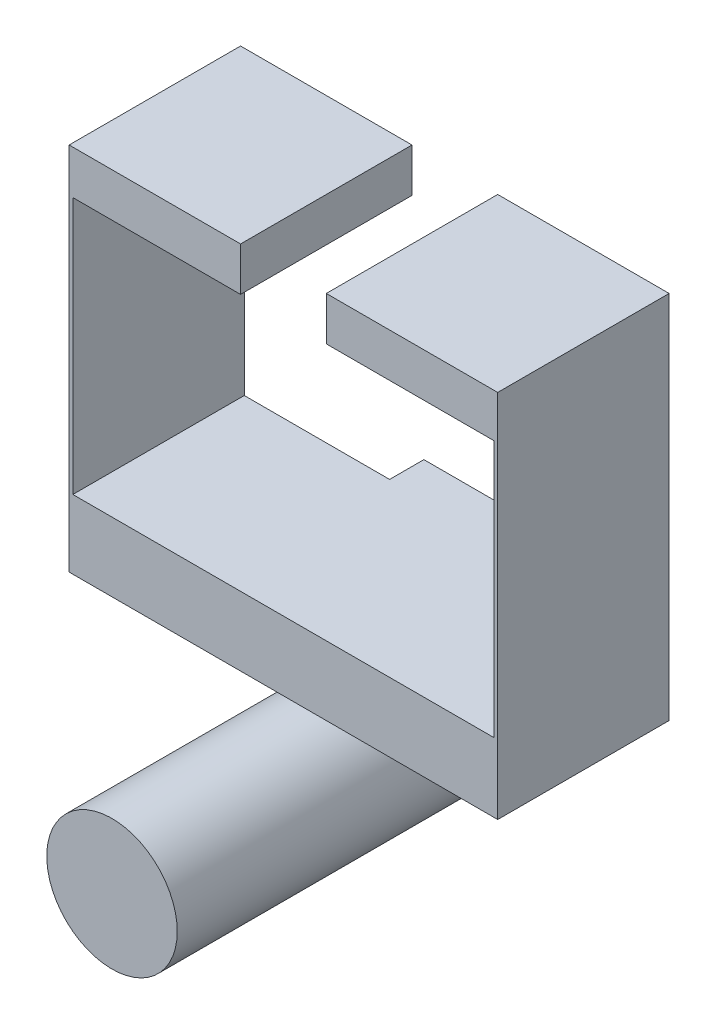
ISO-10303-21;
HEADER;
FILE_DESCRIPTION(('STEP AP214'),'2;1');
FILE_NAME('part.step','',(''),(''),'','','');
FILE_SCHEMA(('AUTOMOTIVE_DESIGN { 1 0 10303 214 1 1 1 1 }'));
ENDSEC;
DATA;
#1=APPLICATION_CONTEXT('core data for automotive mechanical design processes');
#2=APPLICATION_PROTOCOL_DEFINITION('international standard','automotive_design',2000,#1);
#3=PRODUCT_CONTEXT('',#1,'mechanical');
#4=PRODUCT('Part','Part','',(#3));
#5=PRODUCT_RELATED_PRODUCT_CATEGORY('part','',(#4));
#6=PRODUCT_DEFINITION_FORMATION('','',#4);
#7=PRODUCT_DEFINITION_CONTEXT('part definition',#1,'design');
#8=PRODUCT_DEFINITION('design','',#6,#7);
#9=PRODUCT_DEFINITION_SHAPE('','',#8);
#10=(LENGTH_UNIT() NAMED_UNIT(*) SI_UNIT(.MILLI.,.METRE.));
#11=(NAMED_UNIT(*) PLANE_ANGLE_UNIT() SI_UNIT($,.RADIAN.));
#12=(NAMED_UNIT(*) SI_UNIT($,.STERADIAN.) SOLID_ANGLE_UNIT());
#13=UNCERTAINTY_MEASURE_WITH_UNIT(LENGTH_MEASURE(1.E-05),#10,'distance_accuracy_value','');
#14=(GEOMETRIC_REPRESENTATION_CONTEXT(3) GLOBAL_UNCERTAINTY_ASSIGNED_CONTEXT((#13)) GLOBAL_UNIT_ASSIGNED_CONTEXT((#10,
#11,#12)) REPRESENTATION_CONTEXT('',''));
#15=CARTESIAN_POINT('',(0.,0.,0.));
#16=DIRECTION('',(0.,0.,1.));
#17=DIRECTION('',(1.,0.,0.));
#18=AXIS2_PLACEMENT_3D('',#15,#16,#17);
#19=CARTESIAN_POINT('',(0.,0.,0.));
#20=DIRECTION('',(0.,0.,1.));
#21=DIRECTION('',(1.,0.,0.));
#22=AXIS2_PLACEMENT_3D('',#19,#20,#21);
#23=PLANE('',#22);
#24=DIRECTION('',(0.,-1.,0.));
#25=VECTOR('',#24,1.);
#26=CARTESIAN_POINT('',(9.66721513747675,22.935187233977,0.));
#27=LINE('',#26,#25);
#28=CARTESIAN_POINT('',(9.66721513747675,22.935187233977,0.));
#29=VERTEX_POINT('',#28);
#30=CARTESIAN_POINT('',(9.66721513747675,12.7,0.));
#31=VERTEX_POINT('',#30);
#32=EDGE_CURVE('E61',#29,#31,#27,.T.);
#33=ORIENTED_EDGE('',*,*,#32,.F.);
#34=DIRECTION('',(1.,0.,0.));
#35=VECTOR('',#34,1.);
#36=CARTESIAN_POINT('',(31.75,22.935187233977,0.));
#37=LINE('',#36,#35);
#38=CARTESIAN_POINT('',(31.2000836865377,22.935187233977,0.));
#39=VERTEX_POINT('',#38);
#40=EDGE_CURVE('E435',#29,#39,#37,.T.);
#41=ORIENTED_EDGE('',*,*,#40,.T.);
#42=DIRECTION('',(0.,1.,0.));
#43=VECTOR('',#42,1.);
#44=CARTESIAN_POINT('',(31.2000836865377,22.935187233977,0.));
#45=LINE('',#44,#43);
#46=CARTESIAN_POINT('',(31.2000836865377,61.035187233977,0.));
#47=VERTEX_POINT('',#46);
#48=EDGE_CURVE('E363',#39,#47,#45,.T.);
#49=ORIENTED_EDGE('',*,*,#48,.T.);
#50=DIRECTION('',(-1.,0.,0.));
#51=VECTOR('',#50,1.);
#52=CARTESIAN_POINT('',(31.75,61.035187233977,0.));
#53=LINE('',#52,#51);
#54=CARTESIAN_POINT('',(6.35,61.035187233977,0.));
#55=VERTEX_POINT('',#54);
#56=EDGE_CURVE('E325',#47,#55,#53,.T.);
#57=ORIENTED_EDGE('',*,*,#56,.T.);
#58=DIRECTION('',(0.,1.,0.));
#59=VECTOR('',#58,1.);
#60=CARTESIAN_POINT('',(6.35,61.035187233977,0.));
#61=LINE('',#60,#59);
#62=CARTESIAN_POINT('',(6.35,67.5084880215063,0.));
#63=VERTEX_POINT('',#62);
#64=EDGE_CURVE('E320',#55,#63,#61,.T.);
#65=ORIENTED_EDGE('',*,*,#64,.T.);
#66=DIRECTION('',(1.,0.,0.));
#67=VECTOR('',#66,1.);
#68=CARTESIAN_POINT('',(31.75,67.5084880215063,0.));
#69=LINE('',#68,#67);
#70=CARTESIAN_POINT('',(31.75,67.5084880215063,0.));
#71=VERTEX_POINT('',#70);
#72=EDGE_CURVE('E316',#63,#71,#69,.T.);
#73=ORIENTED_EDGE('',*,*,#72,.T.);
#74=DIRECTION('',(0.,-1.,0.));
#75=VECTOR('',#74,1.);
#76=CARTESIAN_POINT('',(31.75,12.7,0.));
#77=LINE('',#76,#75);
#78=CARTESIAN_POINT('',(31.75,12.7,0.));
#79=VERTEX_POINT('',#78);
#80=EDGE_CURVE('E478',#71,#79,#77,.T.);
#81=ORIENTED_EDGE('',*,*,#80,.T.);
#82=DIRECTION('',(-0.866865610255748,-0.498541887664347,0.));
#83=VECTOR('',#82,1.);
#84=CARTESIAN_POINT('',(31.75,12.7,0.));
#85=LINE('',#84,#83);
#86=CARTESIAN_POINT('',(9.66721513747675,0.,0.));
#87=VERTEX_POINT('',#86);
#88=EDGE_CURVE('E266',#79,#87,#85,.T.);
#89=ORIENTED_EDGE('',*,*,#88,.T.);
#90=CARTESIAN_POINT('',(9.66721513747675,2.54,0.));
#91=VERTEX_POINT('',#90);
#92=EDGE_CURVE('E12',#91,#87,#27,.T.);
#93=ORIENTED_EDGE('',*,*,#92,.F.);
#94=DIRECTION('',(0.887258575606606,0.461272392423974,0.));
#95=VECTOR('',#94,1.);
#96=CARTESIAN_POINT('',(9.66721513747675,2.54,0.));
#97=LINE('',#96,#95);
#98=CARTESIAN_POINT('',(29.21,12.7,0.));
#99=VERTEX_POINT('',#98);
#100=EDGE_CURVE('E280',#91,#99,#97,.T.);
#101=ORIENTED_EDGE('',*,*,#100,.T.);
#102=DIRECTION('',(-1.,0.,0.));
#103=VECTOR('',#102,1.);
#104=CARTESIAN_POINT('',(-9.66721513747675,12.7,0.));
#105=LINE('',#104,#103);
#106=EDGE_CURVE('E470',#99,#31,#105,.T.);
#107=ORIENTED_EDGE('',*,*,#106,.T.);
#108=EDGE_LOOP('',(#33,#41,#49,#57,#65,#73,#81,#89,#93,#101,#107));
#109=FACE_BOUND('',#108,.T.);
#110=ADVANCED_FACE('F50',(#109),#23,.F.);
#111=DIRECTION('',(0.,1.,0.));
#112=VECTOR('',#111,1.);
#113=CARTESIAN_POINT('',(-9.66721513747675,22.935187233977,0.));
#114=LINE('',#113,#112);
#115=CARTESIAN_POINT('',(-9.66721513747675,0.,0.));
#116=VERTEX_POINT('',#115);
#117=CARTESIAN_POINT('',(-9.66721513747675,2.54,0.));
#118=VERTEX_POINT('',#117);
#119=EDGE_CURVE('E237',#116,#118,#114,.T.);
#120=ORIENTED_EDGE('',*,*,#119,.F.);
#121=DIRECTION('',(-0.866865610255748,0.498541887664346,0.));
#122=VECTOR('',#121,1.);
#123=CARTESIAN_POINT('',(-9.66721513747675,0.,0.));
#124=LINE('',#123,#122);
#125=CARTESIAN_POINT('',(-31.75,12.7,0.));
#126=VERTEX_POINT('',#125);
#127=EDGE_CURVE('E261',#116,#126,#124,.T.);
#128=ORIENTED_EDGE('',*,*,#127,.T.);
#129=DIRECTION('',(0.,1.,0.));
#130=VECTOR('',#129,1.);
#131=CARTESIAN_POINT('',(-31.75,22.935187233977,0.));
#132=LINE('',#131,#130);
#133=CARTESIAN_POINT('',(-31.75,67.5084880215063,0.));
#134=VERTEX_POINT('',#133);
#135=EDGE_CURVE('E379',#126,#134,#132,.T.);
#136=ORIENTED_EDGE('',*,*,#135,.T.);
#137=DIRECTION('',(1.,0.,0.));
#138=VECTOR('',#137,1.);
#139=CARTESIAN_POINT('',(-31.75,67.5084880215063,0.));
#140=LINE('',#139,#138);
#141=CARTESIAN_POINT('',(-6.35,67.5084880215063,0.));
#142=VERTEX_POINT('',#141);
#143=EDGE_CURVE('E329',#134,#142,#140,.T.);
#144=ORIENTED_EDGE('',*,*,#143,.T.);
#145=DIRECTION('',(0.,-1.,0.));
#146=VECTOR('',#145,1.);
#147=CARTESIAN_POINT('',(-6.35,61.035187233977,0.));
#148=LINE('',#147,#146);
#149=CARTESIAN_POINT('',(-6.35,61.035187233977,0.));
#150=VERTEX_POINT('',#149);
#151=EDGE_CURVE('E400',#142,#150,#148,.T.);
#152=ORIENTED_EDGE('',*,*,#151,.T.);
#153=DIRECTION('',(-1.,0.,0.));
#154=VECTOR('',#153,1.);
#155=CARTESIAN_POINT('',(-31.75,61.035187233977,0.));
#156=LINE('',#155,#154);
#157=CARTESIAN_POINT('',(-31.2000836865377,61.035187233977,0.));
#158=VERTEX_POINT('',#157);
#159=EDGE_CURVE('E387',#150,#158,#156,.T.);
#160=ORIENTED_EDGE('',*,*,#159,.T.);
#161=DIRECTION('',(0.,-1.,0.));
#162=VECTOR('',#161,1.);
#163=CARTESIAN_POINT('',(-31.2000836865377,22.935187233977,0.));
#164=LINE('',#163,#162);
#165=CARTESIAN_POINT('',(-31.2000836865377,22.935187233977,0.));
#166=VERTEX_POINT('',#165);
#167=EDGE_CURVE('E371',#158,#166,#164,.T.);
#168=ORIENTED_EDGE('',*,*,#167,.T.);
#169=CARTESIAN_POINT('',(-9.66721513747675,22.935187233977,0.));
#170=VERTEX_POINT('',#169);
#171=EDGE_CURVE('E395',#166,#170,#37,.T.);
#172=ORIENTED_EDGE('',*,*,#171,.T.);
#173=CARTESIAN_POINT('',(-9.66721513747675,12.7,0.));
#174=VERTEX_POINT('',#173);
#175=EDGE_CURVE('E59',#174,#170,#114,.T.);
#176=ORIENTED_EDGE('',*,*,#175,.F.);
#177=CARTESIAN_POINT('',(-29.21,12.7,0.));
#178=VERTEX_POINT('',#177);
#179=EDGE_CURVE('E472',#174,#178,#105,.T.);
#180=ORIENTED_EDGE('',*,*,#179,.T.);
#181=DIRECTION('',(0.887258575606606,-0.461272392423974,0.));
#182=VECTOR('',#181,1.);
#183=CARTESIAN_POINT('',(-29.21,12.7,0.));
#184=LINE('',#183,#182);
#185=EDGE_CURVE('E258',#178,#118,#184,.T.);
#186=ORIENTED_EDGE('',*,*,#185,.T.);
#187=EDGE_LOOP('',(#120,#128,#136,#144,#152,#160,#168,#172,#176,#180,#186));
#188=FACE_BOUND('',#187,.T.);
#189=ADVANCED_FACE('F394',(#188),#23,.F.);
#190=CARTESIAN_POINT('',(0.,0.,50.8));
#191=DIRECTION('',(0.,0.,-1.));
#192=DIRECTION('',(-1.,0.,0.));
#193=AXIS2_PLACEMENT_3D('',#190,#191,#192);
#194=CYLINDRICAL_SURFACE('',#193,9.66721513747675);
#195=CARTESIAN_POINT('',(0.,0.,50.8));
#196=DIRECTION('',(0.,0.,1.));
#197=DIRECTION('',(1.,0.,0.));
#198=AXIS2_PLACEMENT_3D('',#195,#196,#197);
#199=CIRCLE('',#198,9.66721513747675);
#200=CARTESIAN_POINT('',(9.66721513747675,0.,50.8));
#201=VERTEX_POINT('',#200);
#202=EDGE_CURVE('E503',#201,#201,#199,.T.);
#203=ORIENTED_EDGE('',*,*,#202,.F.);
#204=EDGE_LOOP('',(#203));
#205=FACE_BOUND('',#204,.T.);
#206=DIRECTION('',(0.,0.,-1.));
#207=VECTOR('',#206,1.);
#208=CARTESIAN_POINT('',(9.66721513747675,0.,8.89));
#209=LINE('',#208,#207);
#210=CARTESIAN_POINT('',(9.66721513747675,0.,8.89));
#211=VERTEX_POINT('',#210);
#212=EDGE_CURVE('E500',#211,#87,#209,.T.);
#213=ORIENTED_EDGE('',*,*,#212,.F.);
#214=CARTESIAN_POINT('',(0.,0.,8.89));
#215=DIRECTION('',(0.,0.,-1.));
#216=DIRECTION('',(-1.,0.,0.));
#217=AXIS2_PLACEMENT_3D('',#214,#215,#216);
#218=CIRCLE('',#217,9.66721513747675);
#219=CARTESIAN_POINT('',(-9.66721513747675,0.,8.89));
#220=VERTEX_POINT('',#219);
#221=EDGE_CURVE('E54',#220,#211,#218,.T.);
#222=ORIENTED_EDGE('',*,*,#221,.F.);
#223=DIRECTION('',(0.,0.,-1.));
#224=VECTOR('',#223,1.);
#225=CARTESIAN_POINT('',(-9.66721513747675,0.,8.89));
#226=LINE('',#225,#224);
#227=EDGE_CURVE('E499',#220,#116,#226,.T.);
#228=ORIENTED_EDGE('',*,*,#227,.T.);
#229=DIRECTION('',(0.,0.,1.));
#230=VECTOR('',#229,1.);
#231=CARTESIAN_POINT('',(-9.66721513747675,0.,-5.07999999999999));
#232=LINE('',#231,#230);
#233=CARTESIAN_POINT('',(-9.66721513747675,0.,-5.07999999999999));
#234=VERTEX_POINT('',#233);
#235=EDGE_CURVE('E222',#234,#116,#232,.T.);
#236=ORIENTED_EDGE('',*,*,#235,.F.);
#237=CARTESIAN_POINT('',(0.,0.,-5.07999999999999));
#238=DIRECTION('',(0.,0.,-1.));
#239=DIRECTION('',(-1.,0.,0.));
#240=AXIS2_PLACEMENT_3D('',#237,#238,#239);
#241=CIRCLE('',#240,9.66721513747675);
#242=CARTESIAN_POINT('',(9.66721513747675,0.,-5.07999999999999));
#243=VERTEX_POINT('',#242);
#244=EDGE_CURVE('E215',#243,#234,#241,.T.);
#245=ORIENTED_EDGE('',*,*,#244,.F.);
#246=DIRECTION('',(0.,0.,1.));
#247=VECTOR('',#246,1.);
#248=CARTESIAN_POINT('',(9.66721513747675,0.,-5.07999999999999));
#249=LINE('',#248,#247);
#250=EDGE_CURVE('E219',#243,#87,#249,.T.);
#251=ORIENTED_EDGE('',*,*,#250,.T.);
#252=EDGE_LOOP('',(#213,#222,#228,#236,#245,#251));
#253=FACE_BOUND('',#252,.T.);
#254=ADVANCED_FACE('F52',(#205,#253),#194,.T.);
#255=CARTESIAN_POINT('',(0.,0.,50.8));
#256=DIRECTION('',(0.,0.,1.));
#257=DIRECTION('',(1.,0.,0.));
#258=AXIS2_PLACEMENT_3D('',#255,#256,#257);
#259=PLANE('',#258);
#260=ORIENTED_EDGE('',*,*,#202,.T.);
#261=EDGE_LOOP('',(#260));
#262=FACE_BOUND('',#261,.T.);
#263=ADVANCED_FACE('F590',(#262),#259,.T.);
#264=CARTESIAN_POINT('',(9.66721513747675,12.7,8.89));
#265=DIRECTION('',(1.,0.,0.));
#266=DIRECTION('',(0.,1.,0.));
#267=AXIS2_PLACEMENT_3D('',#264,#265,#266);
#268=PLANE('',#267);
#269=DIRECTION('',(0.,0.,-1.));
#270=VECTOR('',#269,1.);
#271=CARTESIAN_POINT('',(9.66721513747675,2.54,8.89));
#272=LINE('',#271,#270);
#273=CARTESIAN_POINT('',(9.66721513747675,2.54,8.89));
#274=VERTEX_POINT('',#273);
#275=EDGE_CURVE('E299',#274,#91,#272,.T.);
#276=ORIENTED_EDGE('',*,*,#275,.T.);
#277=ORIENTED_EDGE('',*,*,#92,.T.);
#278=ORIENTED_EDGE('',*,*,#250,.F.);
#279=DIRECTION('',(0.,-1.,0.));
#280=VECTOR('',#279,1.);
#281=CARTESIAN_POINT('',(9.66721513747675,22.935187233977,-5.07999999999999));
#282=LINE('',#281,#280);
#283=CARTESIAN_POINT('',(9.66721513747675,22.935187233977,-5.07999999999999));
#284=VERTEX_POINT('',#283);
#285=EDGE_CURVE('E227',#284,#243,#282,.T.);
#286=ORIENTED_EDGE('',*,*,#285,.F.);
#287=DIRECTION('',(0.,0.,1.));
#288=VECTOR('',#287,1.);
#289=CARTESIAN_POINT('',(9.66721513747675,22.935187233977,-5.07999999999999));
#290=LINE('',#289,#288);
#291=EDGE_CURVE('E533',#284,#29,#290,.T.);
#292=ORIENTED_EDGE('',*,*,#291,.T.);
#293=ORIENTED_EDGE('',*,*,#32,.T.);
#294=DIRECTION('',(0.,0.,-1.));
#295=VECTOR('',#294,1.);
#296=CARTESIAN_POINT('',(9.66721513747675,12.7,8.89));
#297=LINE('',#296,#295);
#298=CARTESIAN_POINT('',(9.66721513747675,12.7,8.89));
#299=VERTEX_POINT('',#298);
#300=EDGE_CURVE('E504',#299,#31,#297,.T.);
#301=ORIENTED_EDGE('',*,*,#300,.F.);
#302=DIRECTION('',(0.,-1.,0.));
#303=VECTOR('',#302,1.);
#304=CARTESIAN_POINT('',(9.66721513747675,12.7,8.89));
#305=LINE('',#304,#303);
#306=EDGE_CURVE('E496',#299,#274,#305,.T.);
#307=ORIENTED_EDGE('',*,*,#306,.T.);
#308=EDGE_LOOP('',(#276,#277,#278,#286,#292,#293,#301,#307));
#309=FACE_BOUND('',#308,.T.);
#310=ADVANCED_FACE('F240',(#309),#268,.T.);
#311=CARTESIAN_POINT('',(-9.66721513747675,0.,8.89));
#312=DIRECTION('',(-1.,0.,0.));
#313=DIRECTION('',(0.,0.,1.));
#314=AXIS2_PLACEMENT_3D('',#311,#312,#313);
#315=PLANE('',#314);
#316=DIRECTION('',(0.,0.,-1.));
#317=VECTOR('',#316,1.);
#318=CARTESIAN_POINT('',(-9.66721513747675,2.54,8.89));
#319=LINE('',#318,#317);
#320=CARTESIAN_POINT('',(-9.66721513747675,2.54,8.89));
#321=VERTEX_POINT('',#320);
#322=EDGE_CURVE('E75',#321,#118,#319,.T.);
#323=ORIENTED_EDGE('',*,*,#322,.F.);
#324=DIRECTION('',(0.,1.,0.));
#325=VECTOR('',#324,1.);
#326=CARTESIAN_POINT('',(-9.66721513747675,0.,8.89));
#327=LINE('',#326,#325);
#328=CARTESIAN_POINT('',(-9.66721513747675,12.7,8.89));
#329=VERTEX_POINT('',#328);
#330=EDGE_CURVE('E485',#321,#329,#327,.T.);
#331=ORIENTED_EDGE('',*,*,#330,.T.);
#332=DIRECTION('',(0.,0.,-1.));
#333=VECTOR('',#332,1.);
#334=CARTESIAN_POINT('',(-9.66721513747675,12.7,8.89));
#335=LINE('',#334,#333);
#336=EDGE_CURVE('E507',#329,#174,#335,.T.);
#337=ORIENTED_EDGE('',*,*,#336,.T.);
#338=ORIENTED_EDGE('',*,*,#175,.T.);
#339=DIRECTION('',(0.,0.,1.));
#340=VECTOR('',#339,1.);
#341=CARTESIAN_POINT('',(-9.66721513747675,22.935187233977,-5.07999999999999));
#342=LINE('',#341,#340);
#343=CARTESIAN_POINT('',(-9.66721513747675,22.935187233977,-5.07999999999999));
#344=VERTEX_POINT('',#343);
#345=EDGE_CURVE('E247',#344,#170,#342,.T.);
#346=ORIENTED_EDGE('',*,*,#345,.F.);
#347=DIRECTION('',(0.,1.,0.));
#348=VECTOR('',#347,1.);
#349=CARTESIAN_POINT('',(-9.66721513747675,22.935187233977,-5.07999999999999));
#350=LINE('',#349,#348);
#351=EDGE_CURVE('E226',#234,#344,#350,.T.);
#352=ORIENTED_EDGE('',*,*,#351,.F.);
#353=ORIENTED_EDGE('',*,*,#235,.T.);
#354=ORIENTED_EDGE('',*,*,#119,.T.);
#355=EDGE_LOOP('',(#323,#331,#337,#338,#346,#352,#353,#354));
#356=FACE_BOUND('',#355,.T.);
#357=ADVANCED_FACE('F535',(#356),#315,.T.);
#358=CARTESIAN_POINT('',(0.,0.,8.89));
#359=DIRECTION('',(0.,0.,-1.));
#360=DIRECTION('',(-1.,0.,0.));
#361=AXIS2_PLACEMENT_3D('',#358,#359,#360);
#362=PLANE('',#361);
#363=ORIENTED_EDGE('',*,*,#330,.F.);
#364=DIRECTION('',(0.887258575606606,-0.461272392423974,0.));
#365=VECTOR('',#364,1.);
#366=CARTESIAN_POINT('',(-29.21,12.7,8.89));
#367=LINE('',#366,#365);
#368=CARTESIAN_POINT('',(-29.21,12.7,8.89));
#369=VERTEX_POINT('',#368);
#370=EDGE_CURVE('E255',#369,#321,#367,.T.);
#371=ORIENTED_EDGE('',*,*,#370,.F.);
#372=DIRECTION('',(1.,0.,0.));
#373=VECTOR('',#372,1.);
#374=CARTESIAN_POINT('',(-31.75,12.7,8.89));
#375=LINE('',#374,#373);
#376=CARTESIAN_POINT('',(-31.75,12.7,8.89));
#377=VERTEX_POINT('',#376);
#378=EDGE_CURVE('E269',#377,#369,#375,.T.);
#379=ORIENTED_EDGE('',*,*,#378,.F.);
#380=DIRECTION('',(-0.866865610255748,0.498541887664346,0.));
#381=VECTOR('',#380,1.);
#382=CARTESIAN_POINT('',(-9.66721513747675,0.,8.89));
#383=LINE('',#382,#381);
#384=EDGE_CURVE('E262',#220,#377,#383,.T.);
#385=ORIENTED_EDGE('',*,*,#384,.F.);
#386=ORIENTED_EDGE('',*,*,#221,.T.);
#387=DIRECTION('',(-0.866865610255748,-0.498541887664347,0.));
#388=VECTOR('',#387,1.);
#389=CARTESIAN_POINT('',(31.75,12.7,8.89));
#390=LINE('',#389,#388);
#391=CARTESIAN_POINT('',(31.75,12.7,8.89));
#392=VERTEX_POINT('',#391);
#393=EDGE_CURVE('E279',#392,#211,#390,.T.);
#394=ORIENTED_EDGE('',*,*,#393,.F.);
#395=DIRECTION('',(1.,0.,0.));
#396=VECTOR('',#395,1.);
#397=CARTESIAN_POINT('',(29.21,12.7,8.89));
#398=LINE('',#397,#396);
#399=CARTESIAN_POINT('',(29.21,12.7,8.89));
#400=VERTEX_POINT('',#399);
#401=EDGE_CURVE('E275',#400,#392,#398,.T.);
#402=ORIENTED_EDGE('',*,*,#401,.F.);
#403=DIRECTION('',(0.887258575606606,0.461272392423974,0.));
#404=VECTOR('',#403,1.);
#405=CARTESIAN_POINT('',(9.66721513747675,2.54,8.89));
#406=LINE('',#405,#404);
#407=EDGE_CURVE('E284',#274,#400,#406,.T.);
#408=ORIENTED_EDGE('',*,*,#407,.F.);
#409=ORIENTED_EDGE('',*,*,#306,.F.);
#410=DIRECTION('',(1.,0.,0.));
#411=VECTOR('',#410,1.);
#412=CARTESIAN_POINT('',(-9.66721513747675,12.7,8.89));
#413=LINE('',#412,#411);
#414=EDGE_CURVE('E492',#329,#299,#413,.T.);
#415=ORIENTED_EDGE('',*,*,#414,.F.);
#416=EDGE_LOOP('',(#363,#371,#379,#385,#386,#394,#402,#408,#409,#415));
#417=FACE_BOUND('',#416,.T.);
#418=ADVANCED_FACE('F555',(#417),#362,.F.);
#419=CARTESIAN_POINT('',(-9.66721513747675,12.7,25.4));
#420=DIRECTION('',(0.,-1.,0.));
#421=DIRECTION('',(1.,0.,0.));
#422=AXIS2_PLACEMENT_3D('',#419,#420,#421);
#423=PLANE('',#422);
#424=DIRECTION('',(0.,0.,-1.));
#425=VECTOR('',#424,1.);
#426=CARTESIAN_POINT('',(-29.21,12.7,8.89));
#427=LINE('',#426,#425);
#428=EDGE_CURVE('E245',#369,#178,#427,.T.);
#429=ORIENTED_EDGE('',*,*,#428,.T.);
#430=ORIENTED_EDGE('',*,*,#179,.F.);
#431=ORIENTED_EDGE('',*,*,#336,.F.);
#432=ORIENTED_EDGE('',*,*,#414,.T.);
#433=ORIENTED_EDGE('',*,*,#300,.T.);
#434=ORIENTED_EDGE('',*,*,#106,.F.);
#435=DIRECTION('',(0.,0.,-1.));
#436=VECTOR('',#435,1.);
#437=CARTESIAN_POINT('',(29.21,12.7,8.89));
#438=LINE('',#437,#436);
#439=EDGE_CURVE('E295',#400,#99,#438,.T.);
#440=ORIENTED_EDGE('',*,*,#439,.F.);
#441=ORIENTED_EDGE('',*,*,#401,.T.);
#442=DIRECTION('',(0.,0.,-1.));
#443=VECTOR('',#442,1.);
#444=CARTESIAN_POINT('',(31.75,12.7,25.4));
#445=LINE('',#444,#443);
#446=CARTESIAN_POINT('',(31.75,12.7,25.4));
#447=VERTEX_POINT('',#446);
#448=EDGE_CURVE('E486',#447,#392,#445,.T.);
#449=ORIENTED_EDGE('',*,*,#448,.F.);
#450=DIRECTION('',(-1.,0.,0.));
#451=VECTOR('',#450,1.);
#452=CARTESIAN_POINT('',(31.75,12.7,25.4));
#453=LINE('',#452,#451);
#454=CARTESIAN_POINT('',(-31.75,12.7,25.4));
#455=VERTEX_POINT('',#454);
#456=EDGE_CURVE('E349',#447,#455,#453,.T.);
#457=ORIENTED_EDGE('',*,*,#456,.T.);
#458=DIRECTION('',(0.,0.,-1.));
#459=VECTOR('',#458,1.);
#460=CARTESIAN_POINT('',(-31.75,12.7,25.4));
#461=LINE('',#460,#459);
#462=EDGE_CURVE('E481',#455,#377,#461,.T.);
#463=ORIENTED_EDGE('',*,*,#462,.T.);
#464=ORIENTED_EDGE('',*,*,#378,.T.);
#465=EDGE_LOOP('',(#429,#430,#431,#432,#433,#434,#440,#441,#449,#457,#463,#464));
#466=FACE_BOUND('',#465,.T.);
#467=ADVANCED_FACE('F552',(#466),#423,.T.);
#468=CARTESIAN_POINT('',(-31.75,22.935187233977,25.4));
#469=DIRECTION('',(-1.,0.,0.));
#470=DIRECTION('',(0.,0.,1.));
#471=AXIS2_PLACEMENT_3D('',#468,#469,#470);
#472=PLANE('',#471);
#473=ORIENTED_EDGE('',*,*,#135,.F.);
#474=DIRECTION('',(0.,0.,-1.));
#475=VECTOR('',#474,1.);
#476=CARTESIAN_POINT('',(-31.75,12.7,8.89));
#477=LINE('',#476,#475);
#478=EDGE_CURVE('E251',#377,#126,#477,.T.);
#479=ORIENTED_EDGE('',*,*,#478,.F.);
#480=ORIENTED_EDGE('',*,*,#462,.F.);
#481=DIRECTION('',(0.,1.,0.));
#482=VECTOR('',#481,1.);
#483=CARTESIAN_POINT('',(-31.75,22.935187233977,25.4));
#484=LINE('',#483,#482);
#485=CARTESIAN_POINT('',(-31.75,67.5084880215063,25.4));
#486=VERTEX_POINT('',#485);
#487=EDGE_CURVE('E343',#455,#486,#484,.T.);
#488=ORIENTED_EDGE('',*,*,#487,.T.);
#489=DIRECTION('',(0.,0.,-1.));
#490=VECTOR('',#489,1.);
#491=CARTESIAN_POINT('',(-31.75,67.5084880215063,25.4));
#492=LINE('',#491,#490);
#493=EDGE_CURVE('E419',#486,#134,#492,.T.);
#494=ORIENTED_EDGE('',*,*,#493,.T.);
#495=EDGE_LOOP('',(#473,#479,#480,#488,#494));
#496=FACE_BOUND('',#495,.T.);
#497=ADVANCED_FACE('F572',(#496),#472,.T.);
#498=CARTESIAN_POINT('',(31.75,12.7,25.4));
#499=DIRECTION('',(1.,0.,0.));
#500=DIRECTION('',(0.,0.,-1.));
#501=AXIS2_PLACEMENT_3D('',#498,#499,#500);
#502=PLANE('',#501);
#503=ORIENTED_EDGE('',*,*,#80,.F.);
#504=DIRECTION('',(0.,0.,-1.));
#505=VECTOR('',#504,1.);
#506=CARTESIAN_POINT('',(31.75,67.5084880215063,25.4));
#507=LINE('',#506,#505);
#508=CARTESIAN_POINT('',(31.75,67.5084880215063,25.4));
#509=VERTEX_POINT('',#508);
#510=EDGE_CURVE('E298',#509,#71,#507,.T.);
#511=ORIENTED_EDGE('',*,*,#510,.F.);
#512=DIRECTION('',(0.,-1.,0.));
#513=VECTOR('',#512,1.);
#514=CARTESIAN_POINT('',(31.75,12.7,25.4));
#515=LINE('',#514,#513);
#516=EDGE_CURVE('E342',#509,#447,#515,.T.);
#517=ORIENTED_EDGE('',*,*,#516,.T.);
#518=ORIENTED_EDGE('',*,*,#448,.T.);
#519=DIRECTION('',(0.,0.,-1.));
#520=VECTOR('',#519,1.);
#521=CARTESIAN_POINT('',(31.75,12.7,8.89));
#522=LINE('',#521,#520);
#523=EDGE_CURVE('E288',#392,#79,#522,.T.);
#524=ORIENTED_EDGE('',*,*,#523,.T.);
#525=EDGE_LOOP('',(#503,#511,#517,#518,#524));
#526=FACE_BOUND('',#525,.T.);
#527=ADVANCED_FACE('F546',(#526),#502,.T.);
#528=CARTESIAN_POINT('',(31.75,22.935187233977,25.4));
#529=DIRECTION('',(0.,1.,0.));
#530=DIRECTION('',(0.,0.,1.));
#531=AXIS2_PLACEMENT_3D('',#528,#529,#530);
#532=PLANE('',#531);
#533=DIRECTION('',(0.,0.,-1.));
#534=VECTOR('',#533,1.);
#535=CARTESIAN_POINT('',(31.2000836865377,22.935187233977,25.4));
#536=LINE('',#535,#534);
#537=CARTESIAN_POINT('',(31.2000836865377,22.935187233977,25.4));
#538=VERTEX_POINT('',#537);
#539=EDGE_CURVE('E364',#538,#39,#536,.T.);
#540=ORIENTED_EDGE('',*,*,#539,.T.);
#541=ORIENTED_EDGE('',*,*,#40,.F.);
#542=ORIENTED_EDGE('',*,*,#291,.F.);
#543=DIRECTION('',(1.,0.,0.));
#544=VECTOR('',#543,1.);
#545=CARTESIAN_POINT('',(-9.66721513747675,22.935187233977,-5.07999999999999));
#546=LINE('',#545,#544);
#547=EDGE_CURVE('E232',#344,#284,#546,.T.);
#548=ORIENTED_EDGE('',*,*,#547,.F.);
#549=ORIENTED_EDGE('',*,*,#345,.T.);
#550=ORIENTED_EDGE('',*,*,#171,.F.);
#551=DIRECTION('',(0.,0.,-1.));
#552=VECTOR('',#551,1.);
#553=CARTESIAN_POINT('',(-31.2000836865377,22.935187233977,25.4));
#554=LINE('',#553,#552);
#555=CARTESIAN_POINT('',(-31.2000836865377,22.935187233977,25.4));
#556=VERTEX_POINT('',#555);
#557=EDGE_CURVE('E376',#556,#166,#554,.T.);
#558=ORIENTED_EDGE('',*,*,#557,.F.);
#559=DIRECTION('',(1.,0.,0.));
#560=VECTOR('',#559,1.);
#561=CARTESIAN_POINT('',(31.75,22.935187233977,25.4));
#562=LINE('',#561,#560);
#563=EDGE_CURVE('E337',#556,#538,#562,.T.);
#564=ORIENTED_EDGE('',*,*,#563,.T.);
#565=EDGE_LOOP('',(#540,#541,#542,#548,#549,#550,#558,#564));
#566=FACE_BOUND('',#565,.T.);
#567=ADVANCED_FACE('F439',(#566),#532,.T.);
#568=CARTESIAN_POINT('',(0.,0.,25.4));
#569=DIRECTION('',(0.,0.,-1.));
#570=DIRECTION('',(-1.,0.,0.));
#571=AXIS2_PLACEMENT_3D('',#568,#569,#570);
#572=PLANE('',#571);
#573=ORIENTED_EDGE('',*,*,#487,.F.);
#574=ORIENTED_EDGE('',*,*,#456,.F.);
#575=ORIENTED_EDGE('',*,*,#516,.F.);
#576=DIRECTION('',(1.,0.,0.));
#577=VECTOR('',#576,1.);
#578=CARTESIAN_POINT('',(31.75,67.5084880215063,25.4));
#579=LINE('',#578,#577);
#580=CARTESIAN_POINT('',(6.35,67.5084880215063,25.4));
#581=VERTEX_POINT('',#580);
#582=EDGE_CURVE('E309',#581,#509,#579,.T.);
#583=ORIENTED_EDGE('',*,*,#582,.F.);
#584=DIRECTION('',(0.,1.,0.));
#585=VECTOR('',#584,1.);
#586=CARTESIAN_POINT('',(6.35,61.035187233977,25.4));
#587=LINE('',#586,#585);
#588=CARTESIAN_POINT('',(6.35,61.035187233977,25.4));
#589=VERTEX_POINT('',#588);
#590=EDGE_CURVE('E447',#589,#581,#587,.T.);
#591=ORIENTED_EDGE('',*,*,#590,.F.);
#592=DIRECTION('',(-1.,0.,0.));
#593=VECTOR('',#592,1.);
#594=CARTESIAN_POINT('',(31.75,61.035187233977,25.4));
#595=LINE('',#594,#593);
#596=CARTESIAN_POINT('',(31.2000836865377,61.035187233977,25.4));
#597=VERTEX_POINT('',#596);
#598=EDGE_CURVE('E321',#597,#589,#595,.T.);
#599=ORIENTED_EDGE('',*,*,#598,.F.);
#600=DIRECTION('',(0.,1.,0.));
#601=VECTOR('',#600,1.);
#602=CARTESIAN_POINT('',(31.2000836865377,22.935187233977,25.4));
#603=LINE('',#602,#601);
#604=EDGE_CURVE('E357',#538,#597,#603,.T.);
#605=ORIENTED_EDGE('',*,*,#604,.F.);
#606=ORIENTED_EDGE('',*,*,#563,.F.);
#607=DIRECTION('',(0.,-1.,0.));
#608=VECTOR('',#607,1.);
#609=CARTESIAN_POINT('',(-31.2000836865377,22.935187233977,25.4));
#610=LINE('',#609,#608);
#611=CARTESIAN_POINT('',(-31.2000836865377,61.035187233977,25.4));
#612=VERTEX_POINT('',#611);
#613=EDGE_CURVE('E366',#612,#556,#610,.T.);
#614=ORIENTED_EDGE('',*,*,#613,.F.);
#615=DIRECTION('',(-1.,0.,0.));
#616=VECTOR('',#615,1.);
#617=CARTESIAN_POINT('',(-31.75,61.035187233977,25.4));
#618=LINE('',#617,#616);
#619=CARTESIAN_POINT('',(-6.35,61.035187233977,25.4));
#620=VERTEX_POINT('',#619);
#621=EDGE_CURVE('E389',#620,#612,#618,.T.);
#622=ORIENTED_EDGE('',*,*,#621,.F.);
#623=DIRECTION('',(0.,-1.,0.));
#624=VECTOR('',#623,1.);
#625=CARTESIAN_POINT('',(-6.35,61.035187233977,25.4));
#626=LINE('',#625,#624);
#627=CARTESIAN_POINT('',(-6.35,67.5084880215063,25.4));
#628=VERTEX_POINT('',#627);
#629=EDGE_CURVE('E406',#628,#620,#626,.T.);
#630=ORIENTED_EDGE('',*,*,#629,.F.);
#631=DIRECTION('',(1.,0.,0.));
#632=VECTOR('',#631,1.);
#633=CARTESIAN_POINT('',(-31.75,67.5084880215063,25.4));
#634=LINE('',#633,#632);
#635=EDGE_CURVE('E402',#486,#628,#634,.T.);
#636=ORIENTED_EDGE('',*,*,#635,.F.);
#637=EDGE_LOOP('',(#573,#574,#575,#583,#591,#599,#605,#606,#614,#622,#630,#636));
#638=FACE_BOUND('',#637,.T.);
#639=ADVANCED_FACE('F443',(#638),#572,.F.);
#640=CARTESIAN_POINT('',(-31.2000836865377,22.935187233977,25.4));
#641=DIRECTION('',(1.,0.,0.));
#642=DIRECTION('',(0.,0.,-1.));
#643=AXIS2_PLACEMENT_3D('',#640,#641,#642);
#644=PLANE('',#643);
#645=ORIENTED_EDGE('',*,*,#167,.F.);
#646=DIRECTION('',(0.,0.,-1.));
#647=VECTOR('',#646,1.);
#648=CARTESIAN_POINT('',(-31.2000836865377,61.035187233977,25.4));
#649=LINE('',#648,#647);
#650=EDGE_CURVE('E370',#612,#158,#649,.T.);
#651=ORIENTED_EDGE('',*,*,#650,.F.);
#652=ORIENTED_EDGE('',*,*,#613,.T.);
#653=ORIENTED_EDGE('',*,*,#557,.T.);
#654=EDGE_LOOP('',(#645,#651,#652,#653));
#655=FACE_BOUND('',#654,.T.);
#656=ADVANCED_FACE('F392',(#655),#644,.T.);
#657=CARTESIAN_POINT('',(31.2000836865377,22.935187233977,25.4));
#658=DIRECTION('',(-1.,0.,0.));
#659=DIRECTION('',(0.,0.,1.));
#660=AXIS2_PLACEMENT_3D('',#657,#658,#659);
#661=PLANE('',#660);
#662=ORIENTED_EDGE('',*,*,#48,.F.);
#663=ORIENTED_EDGE('',*,*,#539,.F.);
#664=ORIENTED_EDGE('',*,*,#604,.T.);
#665=DIRECTION('',(0.,0.,-1.));
#666=VECTOR('',#665,1.);
#667=CARTESIAN_POINT('',(31.2000836865377,61.035187233977,25.4));
#668=LINE('',#667,#666);
#669=EDGE_CURVE('E415',#597,#47,#668,.T.);
#670=ORIENTED_EDGE('',*,*,#669,.T.);
#671=EDGE_LOOP('',(#662,#663,#664,#670));
#672=FACE_BOUND('',#671,.T.);
#673=ADVANCED_FACE('F430',(#672),#661,.T.);
#674=CARTESIAN_POINT('',(-31.75,61.035187233977,25.4));
#675=DIRECTION('',(0.,-1.,0.));
#676=DIRECTION('',(0.,0.,-1.));
#677=AXIS2_PLACEMENT_3D('',#674,#675,#676);
#678=PLANE('',#677);
#679=ORIENTED_EDGE('',*,*,#621,.T.);
#680=ORIENTED_EDGE('',*,*,#650,.T.);
#681=ORIENTED_EDGE('',*,*,#159,.F.);
#682=DIRECTION('',(0.,0.,-1.));
#683=VECTOR('',#682,1.);
#684=CARTESIAN_POINT('',(-6.35,61.035187233977,25.4));
#685=LINE('',#684,#683);
#686=EDGE_CURVE('E412',#620,#150,#685,.T.);
#687=ORIENTED_EDGE('',*,*,#686,.F.);
#688=EDGE_LOOP('',(#679,#680,#681,#687));
#689=FACE_BOUND('',#688,.T.);
#690=ADVANCED_FACE('F386',(#689),#678,.T.);
#691=CARTESIAN_POINT('',(-6.35,61.035187233977,25.4));
#692=DIRECTION('',(1.,0.,0.));
#693=DIRECTION('',(0.,0.,-1.));
#694=AXIS2_PLACEMENT_3D('',#691,#692,#693);
#695=PLANE('',#694);
#696=ORIENTED_EDGE('',*,*,#151,.F.);
#697=DIRECTION('',(0.,0.,-1.));
#698=VECTOR('',#697,1.);
#699=CARTESIAN_POINT('',(-6.35,67.5084880215063,25.4));
#700=LINE('',#699,#698);
#701=EDGE_CURVE('E416',#628,#142,#700,.T.);
#702=ORIENTED_EDGE('',*,*,#701,.F.);
#703=ORIENTED_EDGE('',*,*,#629,.T.);
#704=ORIENTED_EDGE('',*,*,#686,.T.);
#705=EDGE_LOOP('',(#696,#702,#703,#704));
#706=FACE_BOUND('',#705,.T.);
#707=ADVANCED_FACE('F465',(#706),#695,.T.);
#708=CARTESIAN_POINT('',(-31.75,67.5084880215063,25.4));
#709=DIRECTION('',(0.,1.,0.));
#710=DIRECTION('',(0.,0.,1.));
#711=AXIS2_PLACEMENT_3D('',#708,#709,#710);
#712=PLANE('',#711);
#713=ORIENTED_EDGE('',*,*,#143,.F.);
#714=ORIENTED_EDGE('',*,*,#493,.F.);
#715=ORIENTED_EDGE('',*,*,#635,.T.);
#716=ORIENTED_EDGE('',*,*,#701,.T.);
#717=EDGE_LOOP('',(#713,#714,#715,#716));
#718=FACE_BOUND('',#717,.T.);
#719=ADVANCED_FACE('F461',(#718),#712,.T.);
#720=CARTESIAN_POINT('',(31.75,67.5084880215063,25.4));
#721=DIRECTION('',(0.,1.,0.));
#722=DIRECTION('',(0.,0.,1.));
#723=AXIS2_PLACEMENT_3D('',#720,#721,#722);
#724=PLANE('',#723);
#725=ORIENTED_EDGE('',*,*,#72,.F.);
#726=DIRECTION('',(0.,0.,-1.));
#727=VECTOR('',#726,1.);
#728=CARTESIAN_POINT('',(6.35,67.5084880215063,25.4));
#729=LINE('',#728,#727);
#730=EDGE_CURVE('E310',#581,#63,#729,.T.);
#731=ORIENTED_EDGE('',*,*,#730,.F.);
#732=ORIENTED_EDGE('',*,*,#582,.T.);
#733=ORIENTED_EDGE('',*,*,#510,.T.);
#734=EDGE_LOOP('',(#725,#731,#732,#733));
#735=FACE_BOUND('',#734,.T.);
#736=ADVANCED_FACE('F549',(#735),#724,.T.);
#737=CARTESIAN_POINT('',(6.35,61.035187233977,25.4));
#738=DIRECTION('',(-1.,0.,0.));
#739=DIRECTION('',(0.,0.,1.));
#740=AXIS2_PLACEMENT_3D('',#737,#738,#739);
#741=PLANE('',#740);
#742=ORIENTED_EDGE('',*,*,#64,.F.);
#743=DIRECTION('',(0.,0.,-1.));
#744=VECTOR('',#743,1.);
#745=CARTESIAN_POINT('',(6.35,61.035187233977,25.4));
#746=LINE('',#745,#744);
#747=EDGE_CURVE('E305',#589,#55,#746,.T.);
#748=ORIENTED_EDGE('',*,*,#747,.F.);
#749=ORIENTED_EDGE('',*,*,#590,.T.);
#750=ORIENTED_EDGE('',*,*,#730,.T.);
#751=EDGE_LOOP('',(#742,#748,#749,#750));
#752=FACE_BOUND('',#751,.T.);
#753=ADVANCED_FACE('F722',(#752),#741,.T.);
#754=CARTESIAN_POINT('',(31.75,61.035187233977,25.4));
#755=DIRECTION('',(0.,-1.,0.));
#756=DIRECTION('',(0.,0.,-1.));
#757=AXIS2_PLACEMENT_3D('',#754,#755,#756);
#758=PLANE('',#757);
#759=ORIENTED_EDGE('',*,*,#56,.F.);
#760=ORIENTED_EDGE('',*,*,#669,.F.);
#761=ORIENTED_EDGE('',*,*,#598,.T.);
#762=ORIENTED_EDGE('',*,*,#747,.T.);
#763=EDGE_LOOP('',(#759,#760,#761,#762));
#764=FACE_BOUND('',#763,.T.);
#765=ADVANCED_FACE('F630',(#764),#758,.T.);
#766=CARTESIAN_POINT('',(9.66721513747675,2.54,8.89));
#767=DIRECTION('',(-0.461272392423974,0.887258575606606,0.));
#768=DIRECTION('',(-0.887258575606606,-0.461272392423974,0.));
#769=AXIS2_PLACEMENT_3D('',#766,#767,#768);
#770=PLANE('',#769);
#771=ORIENTED_EDGE('',*,*,#100,.F.);
#772=ORIENTED_EDGE('',*,*,#275,.F.);
#773=ORIENTED_EDGE('',*,*,#407,.T.);
#774=ORIENTED_EDGE('',*,*,#439,.T.);
#775=EDGE_LOOP('',(#771,#772,#773,#774));
#776=FACE_BOUND('',#775,.T.);
#777=ADVANCED_FACE('F560',(#776),#770,.T.);
#778=CARTESIAN_POINT('',(31.75,12.7,8.89));
#779=DIRECTION('',(0.498541887664347,-0.866865610255748,0.));
#780=DIRECTION('',(0.866865610255748,0.498541887664347,0.));
#781=AXIS2_PLACEMENT_3D('',#778,#779,#780);
#782=PLANE('',#781);
#783=ORIENTED_EDGE('',*,*,#88,.F.);
#784=ORIENTED_EDGE('',*,*,#523,.F.);
#785=ORIENTED_EDGE('',*,*,#393,.T.);
#786=ORIENTED_EDGE('',*,*,#212,.T.);
#787=EDGE_LOOP('',(#783,#784,#785,#786));
#788=FACE_BOUND('',#787,.T.);
#789=ADVANCED_FACE('F629',(#788),#782,.T.);
#790=CARTESIAN_POINT('',(-29.21,12.7,8.89));
#791=DIRECTION('',(0.461272392423974,0.887258575606606,0.));
#792=DIRECTION('',(-0.887258575606606,0.461272392423974,0.));
#793=AXIS2_PLACEMENT_3D('',#790,#791,#792);
#794=PLANE('',#793);
#795=ORIENTED_EDGE('',*,*,#185,.F.);
#796=ORIENTED_EDGE('',*,*,#428,.F.);
#797=ORIENTED_EDGE('',*,*,#370,.T.);
#798=ORIENTED_EDGE('',*,*,#322,.T.);
#799=EDGE_LOOP('',(#795,#796,#797,#798));
#800=FACE_BOUND('',#799,.T.);
#801=ADVANCED_FACE('F567',(#800),#794,.T.);
#802=CARTESIAN_POINT('',(-9.66721513747675,0.,8.89));
#803=DIRECTION('',(-0.498541887664347,-0.866865610255748,0.));
#804=DIRECTION('',(0.866865610255748,-0.498541887664347,0.));
#805=AXIS2_PLACEMENT_3D('',#802,#803,#804);
#806=PLANE('',#805);
#807=ORIENTED_EDGE('',*,*,#127,.F.);
#808=ORIENTED_EDGE('',*,*,#227,.F.);
#809=ORIENTED_EDGE('',*,*,#384,.T.);
#810=ORIENTED_EDGE('',*,*,#478,.T.);
#811=EDGE_LOOP('',(#807,#808,#809,#810));
#812=FACE_BOUND('',#811,.T.);
#813=ADVANCED_FACE('F571',(#812),#806,.T.);
#814=CARTESIAN_POINT('',(0.,0.,-5.07999999999999));
#815=DIRECTION('',(0.,0.,-1.));
#816=DIRECTION('',(-1.,0.,0.));
#817=AXIS2_PLACEMENT_3D('',#814,#815,#816);
#818=PLANE('',#817);
#819=ORIENTED_EDGE('',*,*,#285,.T.);
#820=ORIENTED_EDGE('',*,*,#244,.T.);
#821=ORIENTED_EDGE('',*,*,#351,.T.);
#822=ORIENTED_EDGE('',*,*,#547,.T.);
#823=EDGE_LOOP('',(#819,#820,#821,#822));
#824=FACE_BOUND('',#823,.T.);
#825=ADVANCED_FACE('F230',(#824),#818,.T.);
#826=CLOSED_SHELL('',(#110,#189,#254,#263,#310,#357,#418,#467,#497,#527,#567,#639,#656,#673,
#690,#707,#719,#736,#753,#765,#777,#789,#801,#813,#825));
#827=MANIFOLD_SOLID_BREP('B2',#826);
#828=ADVANCED_BREP_SHAPE_REPRESENTATION('',(#18,#827),#14);
#829=SHAPE_DEFINITION_REPRESENTATION(#9,#828);
ENDSEC;
END-ISO-10303-21;
